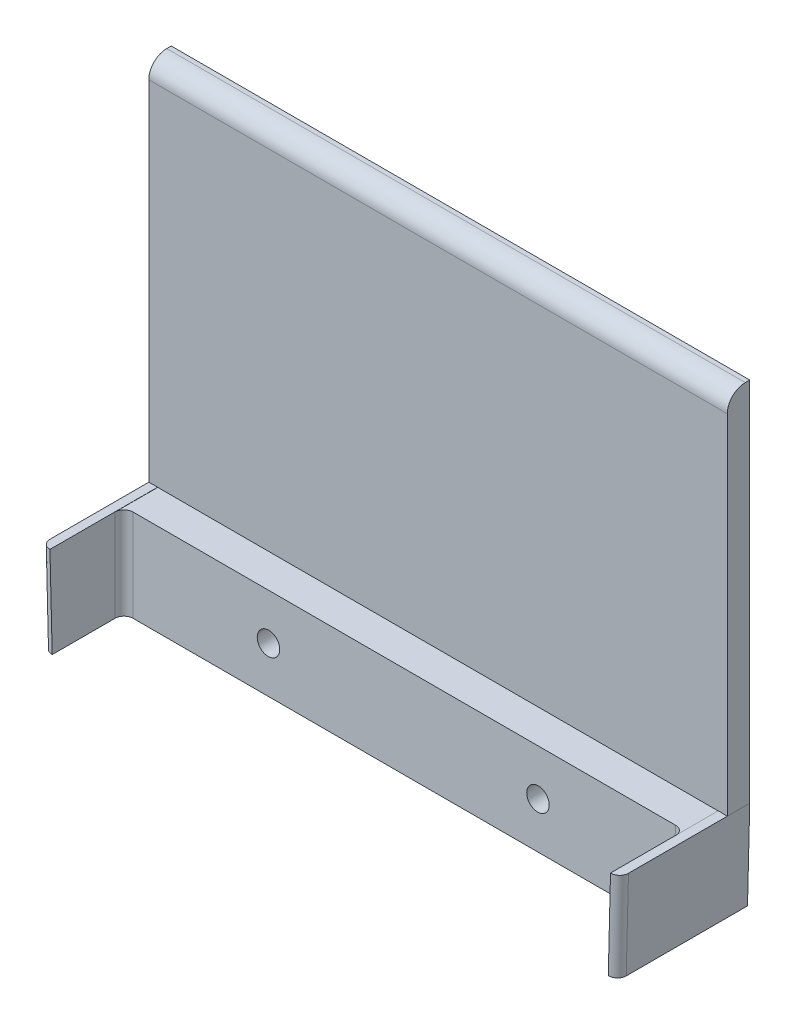
ISO-10303-21;
HEADER;
FILE_DESCRIPTION(('STEP AP214'),'2;1');
FILE_NAME('part.step','',(''),(''),'','','');
FILE_SCHEMA(('AUTOMOTIVE_DESIGN { 1 0 10303 214 1 1 1 1 }'));
ENDSEC;
DATA;
#1=APPLICATION_CONTEXT('core data for automotive mechanical design processes');
#2=APPLICATION_PROTOCOL_DEFINITION('international standard','automotive_design',2000,#1);
#3=PRODUCT_CONTEXT('',#1,'mechanical');
#4=PRODUCT('Part','Part','',(#3));
#5=PRODUCT_RELATED_PRODUCT_CATEGORY('part','',(#4));
#6=PRODUCT_DEFINITION_FORMATION('','',#4);
#7=PRODUCT_DEFINITION_CONTEXT('part definition',#1,'design');
#8=PRODUCT_DEFINITION('design','',#6,#7);
#9=PRODUCT_DEFINITION_SHAPE('','',#8);
#10=(LENGTH_UNIT() NAMED_UNIT(*) SI_UNIT(.MILLI.,.METRE.));
#11=(NAMED_UNIT(*) PLANE_ANGLE_UNIT() SI_UNIT($,.RADIAN.));
#12=(NAMED_UNIT(*) SI_UNIT($,.STERADIAN.) SOLID_ANGLE_UNIT());
#13=UNCERTAINTY_MEASURE_WITH_UNIT(LENGTH_MEASURE(1.E-05),#10,'distance_accuracy_value','');
#14=(GEOMETRIC_REPRESENTATION_CONTEXT(3) GLOBAL_UNCERTAINTY_ASSIGNED_CONTEXT((#13)) GLOBAL_UNIT_ASSIGNED_CONTEXT((#10,
#11,#12)) REPRESENTATION_CONTEXT('',''));
#15=CARTESIAN_POINT('',(0.,0.,0.));
#16=DIRECTION('',(0.,0.,1.));
#17=DIRECTION('',(1.,0.,0.));
#18=AXIS2_PLACEMENT_3D('',#15,#16,#17);
#19=CARTESIAN_POINT('',(-0.144995213723575,5.79980854894297,-2.5));
#20=DIRECTION('',(0.0249921911602031,-0.999687646408123,0.));
#21=DIRECTION('',(0.999687646408123,0.0249921911602031,0.));
#22=AXIS2_PLACEMENT_3D('',#19,#20,#21);
#23=PLANE('',#22);
#24=DIRECTION('',(0.999687646408123,0.0249921911602031,0.));
#25=VECTOR('',#24,1.);
#26=CARTESIAN_POINT('',(-0.144995213723575,5.79980854894297,0.));
#27=LINE('',#26,#25);
#28=CARTESIAN_POINT('',(-32.2002731162217,4.99842660138052,0.));
#29=VERTEX_POINT('',#28);
#30=CARTESIAN_POINT('',(-31.2005854698135,5.02341879254072,0.));
#31=VERTEX_POINT('',#30);
#32=EDGE_CURVE('E121',#29,#31,#27,.T.);
#33=ORIENTED_EDGE('',*,*,#32,.F.);
#34=DIRECTION('',(0.,0.,1.));
#35=VECTOR('',#34,1.);
#36=CARTESIAN_POINT('',(-32.2002731162217,4.99842660138052,-2.5));
#37=LINE('',#36,#35);
#38=CARTESIAN_POINT('',(-32.2002731162217,4.99842660138052,-2.5));
#39=VERTEX_POINT('',#38);
#40=EDGE_CURVE('E115',#39,#29,#37,.T.);
#41=ORIENTED_EDGE('',*,*,#40,.F.);
#42=DIRECTION('',(0.999687646408123,0.0249921911602031,0.));
#43=VECTOR('',#42,1.);
#44=CARTESIAN_POINT('',(-0.144995213723575,5.79980854894297,-2.5));
#45=LINE('',#44,#43);
#46=CARTESIAN_POINT('',(-31.2005854698135,5.02341879254072,-2.5));
#47=VERTEX_POINT('',#46);
#48=EDGE_CURVE('E118',#39,#47,#45,.T.);
#49=ORIENTED_EDGE('',*,*,#48,.T.);
#50=DIRECTION('',(0.,0.,1.));
#51=VECTOR('',#50,1.);
#52=CARTESIAN_POINT('',(-31.2005854698135,5.02341879254072,-2.5));
#53=LINE('',#52,#51);
#54=EDGE_CURVE('E157',#47,#31,#53,.T.);
#55=ORIENTED_EDGE('',*,*,#54,.T.);
#56=EDGE_LOOP('',(#33,#41,#49,#55));
#57=FACE_BOUND('',#56,.T.);
#58=ADVANCED_FACE('F45',(#57),#23,.T.);
#59=CARTESIAN_POINT('',(-32.2002731162217,0.,-2.5));
#60=DIRECTION('',(1.,0.,0.));
#61=DIRECTION('',(0.,0.,-1.));
#62=AXIS2_PLACEMENT_3D('',#59,#60,#61);
#63=PLANE('',#62);
#64=DIRECTION('',(0.,1.,0.));
#65=VECTOR('',#64,1.);
#66=CARTESIAN_POINT('',(-32.2002731162217,0.,0.));
#67=LINE('',#66,#65);
#68=CARTESIAN_POINT('',(-32.2002731162217,43.8,0.));
#69=VERTEX_POINT('',#68);
#70=EDGE_CURVE('E159',#29,#69,#67,.T.);
#71=ORIENTED_EDGE('',*,*,#70,.T.);
#72=CARTESIAN_POINT('',(-32.2002731162217,43.8,-2.));
#73=DIRECTION('',(1.,0.,0.));
#74=DIRECTION('',(0.,0.,-1.));
#75=AXIS2_PLACEMENT_3D('',#72,#73,#74);
#76=CIRCLE('',#75,2.);
#77=CARTESIAN_POINT('',(-32.2002731162217,45.8,-2.));
#78=VERTEX_POINT('',#77);
#79=EDGE_CURVE('E67',#69,#78,#76,.F.);
#80=ORIENTED_EDGE('',*,*,#79,.T.);
#81=DIRECTION('',(0.,0.,1.));
#82=VECTOR('',#81,1.);
#83=CARTESIAN_POINT('',(-32.2002731162217,45.8,-2.5));
#84=LINE('',#83,#82);
#85=CARTESIAN_POINT('',(-32.2002731162217,45.8,-2.5));
#86=VERTEX_POINT('',#85);
#87=EDGE_CURVE('E124',#86,#78,#84,.T.);
#88=ORIENTED_EDGE('',*,*,#87,.F.);
#89=DIRECTION('',(0.,1.,0.));
#90=VECTOR('',#89,1.);
#91=CARTESIAN_POINT('',(-32.2002731162217,0.,-2.5));
#92=LINE('',#91,#90);
#93=EDGE_CURVE('E126',#39,#86,#92,.T.);
#94=ORIENTED_EDGE('',*,*,#93,.F.);
#95=ORIENTED_EDGE('',*,*,#40,.T.);
#96=EDGE_LOOP('',(#71,#80,#88,#94,#95));
#97=FACE_BOUND('',#96,.T.);
#98=ADVANCED_FACE('F127',(#97),#63,.F.);
#99=CARTESIAN_POINT('',(0.,45.8,-2.5));
#100=DIRECTION('',(0.,1.,0.));
#101=DIRECTION('',(0.,0.,1.));
#102=AXIS2_PLACEMENT_3D('',#99,#100,#101);
#103=PLANE('',#102);
#104=ORIENTED_EDGE('',*,*,#87,.T.);
#105=DIRECTION('',(-1.,0.,0.));
#106=VECTOR('',#105,1.);
#107=CARTESIAN_POINT('',(32.2002731162217,45.8,-2.));
#108=LINE('',#107,#106);
#109=CARTESIAN_POINT('',(32.2002731162217,45.8,-2.));
#110=VERTEX_POINT('',#109);
#111=EDGE_CURVE('E53',#78,#110,#108,.F.);
#112=ORIENTED_EDGE('',*,*,#111,.T.);
#113=DIRECTION('',(0.,0.,1.));
#114=VECTOR('',#113,1.);
#115=CARTESIAN_POINT('',(32.2002731162217,45.8,-2.5));
#116=LINE('',#115,#114);
#117=CARTESIAN_POINT('',(32.2002731162217,45.8,-2.5));
#118=VERTEX_POINT('',#117);
#119=EDGE_CURVE('E181',#118,#110,#116,.T.);
#120=ORIENTED_EDGE('',*,*,#119,.F.);
#121=DIRECTION('',(-1.,0.,0.));
#122=VECTOR('',#121,1.);
#123=CARTESIAN_POINT('',(0.,45.8,-2.5));
#124=LINE('',#123,#122);
#125=EDGE_CURVE('E131',#118,#86,#124,.T.);
#126=ORIENTED_EDGE('',*,*,#125,.T.);
#127=EDGE_LOOP('',(#104,#112,#120,#126));
#128=FACE_BOUND('',#127,.T.);
#129=ADVANCED_FACE('F195',(#128),#103,.T.);
#130=CARTESIAN_POINT('',(32.2002731162217,0.,-2.5));
#131=DIRECTION('',(1.,0.,0.));
#132=DIRECTION('',(0.,0.,-1.));
#133=AXIS2_PLACEMENT_3D('',#130,#131,#132);
#134=PLANE('',#133);
#135=ORIENTED_EDGE('',*,*,#119,.T.);
#136=CARTESIAN_POINT('',(32.2002731162217,43.8,-2.));
#137=DIRECTION('',(1.,0.,0.));
#138=DIRECTION('',(0.,0.,-1.));
#139=AXIS2_PLACEMENT_3D('',#136,#137,#138);
#140=CIRCLE('',#139,2.);
#141=CARTESIAN_POINT('',(32.2002731162217,43.8,0.));
#142=VERTEX_POINT('',#141);
#143=EDGE_CURVE('E12',#110,#142,#140,.T.);
#144=ORIENTED_EDGE('',*,*,#143,.T.);
#145=DIRECTION('',(0.,1.,0.));
#146=VECTOR('',#145,1.);
#147=CARTESIAN_POINT('',(32.2002731162217,0.,0.));
#148=LINE('',#147,#146);
#149=CARTESIAN_POINT('',(32.2002731162217,4.99842660138052,0.));
#150=VERTEX_POINT('',#149);
#151=EDGE_CURVE('E161',#150,#142,#148,.T.);
#152=ORIENTED_EDGE('',*,*,#151,.F.);
#153=DIRECTION('',(0.,0.,1.));
#154=VECTOR('',#153,1.);
#155=CARTESIAN_POINT('',(32.2002731162217,4.99842660138052,-2.5));
#156=LINE('',#155,#154);
#157=CARTESIAN_POINT('',(32.2002731162217,4.99842660138052,-2.5));
#158=VERTEX_POINT('',#157);
#159=EDGE_CURVE('E179',#158,#150,#156,.T.);
#160=ORIENTED_EDGE('',*,*,#159,.F.);
#161=DIRECTION('',(0.,1.,0.));
#162=VECTOR('',#161,1.);
#163=CARTESIAN_POINT('',(32.2002731162217,0.,-2.5));
#164=LINE('',#163,#162);
#165=EDGE_CURVE('E144',#158,#118,#164,.T.);
#166=ORIENTED_EDGE('',*,*,#165,.T.);
#167=EDGE_LOOP('',(#135,#144,#152,#160,#166));
#168=FACE_BOUND('',#167,.T.);
#169=ADVANCED_FACE('F193',(#168),#134,.T.);
#170=CARTESIAN_POINT('',(0.144995213723575,5.79980854894297,-2.5));
#171=DIRECTION('',(-0.0249921911602031,-0.999687646408123,0.));
#172=DIRECTION('',(0.999687646408123,-0.0249921911602031,0.));
#173=AXIS2_PLACEMENT_3D('',#170,#171,#172);
#174=PLANE('',#173);
#175=DIRECTION('',(0.999687646408123,-0.0249921911602031,0.));
#176=VECTOR('',#175,1.);
#177=CARTESIAN_POINT('',(0.144995213723575,5.79980854894297,0.));
#178=LINE('',#177,#176);
#179=CARTESIAN_POINT('',(31.2005854698135,5.02341879254072,0.));
#180=VERTEX_POINT('',#179);
#181=EDGE_CURVE('E164',#180,#150,#178,.T.);
#182=ORIENTED_EDGE('',*,*,#181,.F.);
#183=DIRECTION('',(0.,0.,1.));
#184=VECTOR('',#183,1.);
#185=CARTESIAN_POINT('',(31.2005854698135,5.02341879254072,-2.5));
#186=LINE('',#185,#184);
#187=CARTESIAN_POINT('',(31.2005854698135,5.02341879254072,-2.5));
#188=VERTEX_POINT('',#187);
#189=EDGE_CURVE('E177',#188,#180,#186,.T.);
#190=ORIENTED_EDGE('',*,*,#189,.F.);
#191=DIRECTION('',(0.999687646408123,-0.0249921911602031,0.));
#192=VECTOR('',#191,1.);
#193=CARTESIAN_POINT('',(0.144995213723575,5.79980854894297,-2.5));
#194=LINE('',#193,#192);
#195=EDGE_CURVE('E147',#188,#158,#194,.T.);
#196=ORIENTED_EDGE('',*,*,#195,.T.);
#197=ORIENTED_EDGE('',*,*,#159,.T.);
#198=EDGE_LOOP('',(#182,#190,#196,#197));
#199=FACE_BOUND('',#198,.T.);
#200=ADVANCED_FACE('F200',(#199),#174,.T.);
#201=CARTESIAN_POINT('',(31.05559025609,-0.776389756402253,-2.5));
#202=DIRECTION('',(0.999687646408123,-0.0249921911602032,0.));
#203=DIRECTION('',(0.0249921911602032,0.999687646408123,0.));
#204=AXIS2_PLACEMENT_3D('',#201,#202,#203);
#205=PLANE('',#204);
#206=DIRECTION('',(0.0249921911602032,0.999687646408123,0.));
#207=VECTOR('',#206,1.);
#208=CARTESIAN_POINT('',(31.05559025609,-0.776389756402253,0.));
#209=LINE('',#208,#207);
#210=CARTESIAN_POINT('',(31.2,5.00000000000001,0.));
#211=VERTEX_POINT('',#210);
#212=EDGE_CURVE('E167',#211,#180,#209,.T.);
#213=ORIENTED_EDGE('',*,*,#212,.F.);
#214=DIRECTION('',(0.,0.,1.));
#215=VECTOR('',#214,1.);
#216=CARTESIAN_POINT('',(31.2,5.00000000000001,-2.5));
#217=LINE('',#216,#215);
#218=CARTESIAN_POINT('',(31.2,5.00000000000001,-2.5));
#219=VERTEX_POINT('',#218);
#220=EDGE_CURVE('E175',#219,#211,#217,.T.);
#221=ORIENTED_EDGE('',*,*,#220,.F.);
#222=DIRECTION('',(0.0249921911602032,0.999687646408123,0.));
#223=VECTOR('',#222,1.);
#224=CARTESIAN_POINT('',(31.05559025609,-0.776389756402253,-2.5));
#225=LINE('',#224,#223);
#226=EDGE_CURVE('E150',#219,#188,#225,.T.);
#227=ORIENTED_EDGE('',*,*,#226,.T.);
#228=ORIENTED_EDGE('',*,*,#189,.T.);
#229=EDGE_LOOP('',(#213,#221,#227,#228));
#230=FACE_BOUND('',#229,.T.);
#231=ADVANCED_FACE('F203',(#230),#205,.T.);
#232=CARTESIAN_POINT('',(0.,5.00000000000001,-2.5));
#233=DIRECTION('',(0.,-1.,0.));
#234=DIRECTION('',(1.,0.,0.));
#235=AXIS2_PLACEMENT_3D('',#232,#233,#234);
#236=PLANE('',#235);
#237=DIRECTION('',(1.,0.,0.));
#238=VECTOR('',#237,1.);
#239=CARTESIAN_POINT('',(0.,5.00000000000001,0.));
#240=LINE('',#239,#238);
#241=CARTESIAN_POINT('',(-31.2,5.00000000000001,0.));
#242=VERTEX_POINT('',#241);
#243=EDGE_CURVE('E140',#242,#211,#240,.T.);
#244=ORIENTED_EDGE('',*,*,#243,.F.);
#245=DIRECTION('',(0.,0.,1.));
#246=VECTOR('',#245,1.);
#247=CARTESIAN_POINT('',(-31.2,5.00000000000001,-2.5));
#248=LINE('',#247,#246);
#249=CARTESIAN_POINT('',(-31.2,5.00000000000001,-2.5));
#250=VERTEX_POINT('',#249);
#251=EDGE_CURVE('E173',#250,#242,#248,.T.);
#252=ORIENTED_EDGE('',*,*,#251,.F.);
#253=DIRECTION('',(1.,0.,0.));
#254=VECTOR('',#253,1.);
#255=CARTESIAN_POINT('',(0.,5.00000000000001,-2.5));
#256=LINE('',#255,#254);
#257=EDGE_CURVE('E153',#250,#219,#256,.T.);
#258=ORIENTED_EDGE('',*,*,#257,.T.);
#259=ORIENTED_EDGE('',*,*,#220,.T.);
#260=EDGE_LOOP('',(#244,#252,#258,#259));
#261=FACE_BOUND('',#260,.T.);
#262=ADVANCED_FACE('F206',(#261),#236,.T.);
#263=CARTESIAN_POINT('',(-31.05559025609,-0.776389756402253,-2.5));
#264=DIRECTION('',(-0.999687646408123,-0.0249921911602032,0.));
#265=DIRECTION('',(0.0249921911602032,-0.999687646408123,0.));
#266=AXIS2_PLACEMENT_3D('',#263,#264,#265);
#267=PLANE('',#266);
#268=DIRECTION('',(0.0249921911602032,-0.999687646408123,0.));
#269=VECTOR('',#268,1.);
#270=CARTESIAN_POINT('',(-31.05559025609,-0.776389756402253,0.));
#271=LINE('',#270,#269);
#272=EDGE_CURVE('E137',#31,#242,#271,.T.);
#273=ORIENTED_EDGE('',*,*,#272,.F.);
#274=ORIENTED_EDGE('',*,*,#54,.F.);
#275=DIRECTION('',(0.0249921911602032,-0.999687646408123,0.));
#276=VECTOR('',#275,1.);
#277=CARTESIAN_POINT('',(-31.05559025609,-0.776389756402253,-2.5));
#278=LINE('',#277,#276);
#279=EDGE_CURVE('E136',#47,#250,#278,.T.);
#280=ORIENTED_EDGE('',*,*,#279,.T.);
#281=ORIENTED_EDGE('',*,*,#251,.T.);
#282=EDGE_LOOP('',(#273,#274,#280,#281));
#283=FACE_BOUND('',#282,.T.);
#284=ADVANCED_FACE('F209',(#283),#267,.T.);
#285=CARTESIAN_POINT('',(0.,0.,-2.5));
#286=DIRECTION('',(0.,0.,-1.));
#287=DIRECTION('',(-1.,0.,0.));
#288=AXIS2_PLACEMENT_3D('',#285,#286,#287);
#289=PLANE('',#288);
#290=ORIENTED_EDGE('',*,*,#48,.F.);
#291=ORIENTED_EDGE('',*,*,#93,.T.);
#292=ORIENTED_EDGE('',*,*,#125,.F.);
#293=ORIENTED_EDGE('',*,*,#165,.F.);
#294=ORIENTED_EDGE('',*,*,#195,.F.);
#295=ORIENTED_EDGE('',*,*,#226,.F.);
#296=ORIENTED_EDGE('',*,*,#257,.F.);
#297=ORIENTED_EDGE('',*,*,#279,.F.);
#298=EDGE_LOOP('',(#290,#291,#292,#293,#294,#295,#296,#297));
#299=FACE_BOUND('',#298,.T.);
#300=ADVANCED_FACE('F133',(#299),#289,.T.);
#301=CARTESIAN_POINT('',(0.,0.,0.));
#302=DIRECTION('',(0.,0.,-1.));
#303=DIRECTION('',(-1.,0.,0.));
#304=AXIS2_PLACEMENT_3D('',#301,#302,#303);
#305=PLANE('',#304);
#306=ORIENTED_EDGE('',*,*,#151,.T.);
#307=DIRECTION('',(-1.,0.,0.));
#308=VECTOR('',#307,1.);
#309=CARTESIAN_POINT('',(-32.2002731162217,43.8,0.));
#310=LINE('',#309,#308);
#311=EDGE_CURVE('E123',#142,#69,#310,.T.);
#312=ORIENTED_EDGE('',*,*,#311,.T.);
#313=ORIENTED_EDGE('',*,*,#70,.F.);
#314=ORIENTED_EDGE('',*,*,#32,.T.);
#315=ORIENTED_EDGE('',*,*,#272,.T.);
#316=ORIENTED_EDGE('',*,*,#243,.T.);
#317=ORIENTED_EDGE('',*,*,#212,.T.);
#318=ORIENTED_EDGE('',*,*,#181,.T.);
#319=EDGE_LOOP('',(#306,#312,#313,#314,#315,#316,#317,#318));
#320=FACE_BOUND('',#319,.T.);
#321=ADVANCED_FACE('F188',(#320),#305,.F.);
#322=CARTESIAN_POINT('',(0.,43.8,-2.));
#323=DIRECTION('',(1.,0.,0.));
#324=DIRECTION('',(0.,0.,-1.));
#325=AXIS2_PLACEMENT_3D('',#322,#323,#324);
#326=CYLINDRICAL_SURFACE('',#325,2.);
#327=ORIENTED_EDGE('',*,*,#143,.F.);
#328=ORIENTED_EDGE('',*,*,#111,.F.);
#329=ORIENTED_EDGE('',*,*,#79,.F.);
#330=ORIENTED_EDGE('',*,*,#311,.F.);
#331=EDGE_LOOP('',(#327,#328,#329,#330));
#332=FACE_BOUND('',#331,.T.);
#333=ADVANCED_FACE('F47',(#332),#326,.T.);
#334=CLOSED_SHELL('',(#58,#98,#129,#169,#200,#231,#262,#284,#300,#321,#333));
#335=MANIFOLD_SOLID_BREP('B2',#334);
#336=CARTESIAN_POINT('',(0.,5.00000000000001,4.));
#337=DIRECTION('',(0.,-1.,0.));
#338=DIRECTION('',(1.,0.,0.));
#339=AXIS2_PLACEMENT_3D('',#336,#337,#338);
#340=PLANE('',#339);
#341=DIRECTION('',(1.,0.,0.));
#342=VECTOR('',#341,1.);
#343=CARTESIAN_POINT('',(-31.2,5.00000000000002,3.75));
#344=LINE('',#343,#342);
#345=CARTESIAN_POINT('',(-30.2003123535919,5.00000000000002,3.75));
#346=VERTEX_POINT('',#345);
#347=CARTESIAN_POINT('',(30.2003123535919,5.00000000000002,3.75));
#348=VERTEX_POINT('',#347);
#349=EDGE_CURVE('E518',#346,#348,#344,.T.);
#350=ORIENTED_EDGE('',*,*,#349,.T.);
#351=CARTESIAN_POINT('',(30.1996875488129,5.00000000000001,4.75031245118713));
#352=DIRECTION('',(0.,-1.,0.));
#353=DIRECTION('',(-0.707106781186553,0.,0.707106781186542));
#354=AXIS2_PLACEMENT_3D('',#351,#352,#353);
#355=ELLIPSE('',#354,1.00062480480948,1.);
#356=CARTESIAN_POINT('',(31.2,5.00000000000001,4.74968764640812));
#357=VERTEX_POINT('',#356);
#358=EDGE_CURVE('E323',#348,#357,#355,.T.);
#359=ORIENTED_EDGE('',*,*,#358,.T.);
#360=DIRECTION('',(0.,0.,-1.));
#361=VECTOR('',#360,1.);
#362=CARTESIAN_POINT('',(31.2,5.00000000000002,4.));
#363=LINE('',#362,#361);
#364=CARTESIAN_POINT('',(31.2,5.00000000000002,0.));
#365=VERTEX_POINT('',#364);
#366=EDGE_CURVE('E340',#357,#365,#363,.T.);
#367=ORIENTED_EDGE('',*,*,#366,.T.);
#368=DIRECTION('',(-1.,0.,0.));
#369=VECTOR('',#368,1.);
#370=CARTESIAN_POINT('',(0.,5.00000000000001,0.));
#371=LINE('',#370,#369);
#372=CARTESIAN_POINT('',(-31.2,5.00000000000002,0.));
#373=VERTEX_POINT('',#372);
#374=EDGE_CURVE('E520',#365,#373,#371,.T.);
#375=ORIENTED_EDGE('',*,*,#374,.T.);
#376=DIRECTION('',(0.,0.,-1.));
#377=VECTOR('',#376,1.);
#378=CARTESIAN_POINT('',(-31.2,5.,4.));
#379=LINE('',#378,#377);
#380=CARTESIAN_POINT('',(-31.2,5.00000000000001,4.74968764640812));
#381=VERTEX_POINT('',#380);
#382=EDGE_CURVE('E530',#381,#373,#379,.T.);
#383=ORIENTED_EDGE('',*,*,#382,.F.);
#384=CARTESIAN_POINT('',(-30.1996875488129,5.00000000000001,4.75031245118713));
#385=DIRECTION('',(0.,1.,0.));
#386=DIRECTION('',(0.707106781186553,0.,0.707106781186542));
#387=AXIS2_PLACEMENT_3D('',#384,#385,#386);
#388=ELLIPSE('',#387,1.00062480480948,1.);
#389=EDGE_CURVE('E499',#346,#381,#388,.T.);
#390=ORIENTED_EDGE('',*,*,#389,.F.);
#391=EDGE_LOOP('',(#350,#359,#367,#375,#383,#390));
#392=FACE_BOUND('',#391,.T.);
#393=ADVANCED_FACE('F314',(#392),#340,.F.);
#394=CARTESIAN_POINT('',(0.,-4.99999999999999,4.));
#395=DIRECTION('',(0.,-1.,0.));
#396=DIRECTION('',(1.,0.,0.));
#397=AXIS2_PLACEMENT_3D('',#394,#395,#396);
#398=PLANE('',#397);
#399=DIRECTION('',(0.,0.,-1.));
#400=VECTOR('',#399,1.);
#401=CARTESIAN_POINT('',(-30.95,-5.,4.));
#402=LINE('',#401,#400);
#403=CARTESIAN_POINT('',(-30.95,-4.99999999999998,4.99968764640812));
#404=VERTEX_POINT('',#403);
#405=CARTESIAN_POINT('',(-30.95,-4.99999999999999,-2.5));
#406=VERTEX_POINT('',#405);
#407=EDGE_CURVE('E528',#404,#406,#402,.T.);
#408=ORIENTED_EDGE('',*,*,#407,.T.);
#409=DIRECTION('',(-1.,0.,0.));
#410=VECTOR('',#409,1.);
#411=CARTESIAN_POINT('',(0.,-4.99999999999999,-2.5));
#412=LINE('',#411,#410);
#413=CARTESIAN_POINT('',(30.95,-4.99999999999998,-2.5));
#414=VERTEX_POINT('',#413);
#415=EDGE_CURVE('E462',#414,#406,#412,.T.);
#416=ORIENTED_EDGE('',*,*,#415,.F.);
#417=DIRECTION('',(0.,0.,-1.));
#418=VECTOR('',#417,1.);
#419=CARTESIAN_POINT('',(30.95,-4.99999999999998,4.));
#420=LINE('',#419,#418);
#421=CARTESIAN_POINT('',(30.95,-4.99999999999998,4.99968764640812));
#422=VERTEX_POINT('',#421);
#423=EDGE_CURVE('E352',#422,#414,#420,.T.);
#424=ORIENTED_EDGE('',*,*,#423,.F.);
#425=CARTESIAN_POINT('',(29.9496875488129,-4.99999999999998,5.00031245118713));
#426=DIRECTION('',(0.,-1.,0.));
#427=DIRECTION('',(-0.707106781186553,0.,0.707106781186542));
#428=AXIS2_PLACEMENT_3D('',#425,#426,#427);
#429=ELLIPSE('',#428,1.00062480480948,1.);
#430=CARTESIAN_POINT('',(29.9503123535919,-4.99999999999998,4.));
#431=VERTEX_POINT('',#430);
#432=EDGE_CURVE('E43',#422,#431,#429,.F.);
#433=ORIENTED_EDGE('',*,*,#432,.T.);
#434=DIRECTION('',(-1.,0.,0.));
#435=VECTOR('',#434,1.);
#436=CARTESIAN_POINT('',(0.,-4.99999999999999,4.));
#437=LINE('',#436,#435);
#438=CARTESIAN_POINT('',(-29.9503123535919,-5.,4.));
#439=VERTEX_POINT('',#438);
#440=EDGE_CURVE('E521',#431,#439,#437,.T.);
#441=ORIENTED_EDGE('',*,*,#440,.T.);
#442=CARTESIAN_POINT('',(-29.9496875488129,-4.99999999999998,5.00031245118713));
#443=DIRECTION('',(0.,1.,0.));
#444=DIRECTION('',(0.707106781186553,0.,0.707106781186542));
#445=AXIS2_PLACEMENT_3D('',#442,#443,#444);
#446=ELLIPSE('',#445,1.00062480480948,1.);
#447=EDGE_CURVE('E331',#404,#439,#446,.F.);
#448=ORIENTED_EDGE('',*,*,#447,.F.);
#449=EDGE_LOOP('',(#408,#416,#424,#433,#441,#448));
#450=FACE_BOUND('',#449,.T.);
#451=ADVANCED_FACE('F570',(#450),#398,.T.);
#452=CARTESIAN_POINT('',(0.,0.,0.));
#453=DIRECTION('',(0.,0.,1.));
#454=DIRECTION('',(1.,0.,0.));
#455=AXIS2_PLACEMENT_3D('',#452,#453,#454);
#456=PLANE('',#455);
#457=DIRECTION('',(-0.999687646408123,0.0249921911602031,0.));
#458=VECTOR('',#457,1.);
#459=CARTESIAN_POINT('',(32.2002731162217,4.99842660138052,0.));
#460=LINE('',#459,#458);
#461=CARTESIAN_POINT('',(32.2002731162217,4.99842660138052,0.));
#462=VERTEX_POINT('',#461);
#463=CARTESIAN_POINT('',(31.2005854698135,5.02341879254072,0.));
#464=VERTEX_POINT('',#463);
#465=EDGE_CURVE('E508',#462,#464,#460,.T.);
#466=ORIENTED_EDGE('',*,*,#465,.F.);
#467=DIRECTION('',(-1.,0.,0.));
#468=VECTOR('',#467,1.);
#469=CARTESIAN_POINT('',(0.,4.99842660138052,0.));
#470=LINE('',#469,#468);
#471=CARTESIAN_POINT('',(-32.2002731162217,4.99842660138052,0.));
#472=VERTEX_POINT('',#471);
#473=EDGE_CURVE('E432',#462,#472,#470,.T.);
#474=ORIENTED_EDGE('',*,*,#473,.T.);
#475=DIRECTION('',(0.999687646408123,0.0249921911602031,0.));
#476=VECTOR('',#475,1.);
#477=CARTESIAN_POINT('',(-32.2002731162217,4.99842660138052,0.));
#478=LINE('',#477,#476);
#479=CARTESIAN_POINT('',(-31.2005854698135,5.02341879254072,0.));
#480=VERTEX_POINT('',#479);
#481=EDGE_CURVE('E475',#472,#480,#478,.T.);
#482=ORIENTED_EDGE('',*,*,#481,.T.);
#483=DIRECTION('',(-0.0249921911602032,0.999687646408123,0.));
#484=VECTOR('',#483,1.);
#485=CARTESIAN_POINT('',(-30.95,-4.99999999999999,0.));
#486=LINE('',#485,#484);
#487=EDGE_CURVE('E436',#373,#480,#486,.T.);
#488=ORIENTED_EDGE('',*,*,#487,.F.);
#489=ORIENTED_EDGE('',*,*,#374,.F.);
#490=DIRECTION('',(0.0249921911602032,0.999687646408123,0.));
#491=VECTOR('',#490,1.);
#492=CARTESIAN_POINT('',(30.95,-4.99999999999999,0.));
#493=LINE('',#492,#491);
#494=EDGE_CURVE('E503',#365,#464,#493,.T.);
#495=ORIENTED_EDGE('',*,*,#494,.T.);
#496=EDGE_LOOP('',(#466,#474,#482,#488,#489,#495));
#497=FACE_BOUND('',#496,.T.);
#498=ADVANCED_FACE('F576',(#497),#456,.F.);
#499=CARTESIAN_POINT('',(-31.2,-4.99999999999998,4.));
#500=DIRECTION('',(0.,-0.0249921911602031,-0.999687646408123));
#501=DIRECTION('',(0.,0.999687646408123,-0.0249921911602031));
#502=AXIS2_PLACEMENT_3D('',#499,#500,#501);
#503=PLANE('',#502);
#504=CARTESIAN_POINT('',(15.,0.,3.875));
#505=DIRECTION('',(0.,-0.0249921911602031,-0.999687646408123));
#506=DIRECTION('',(0.,0.999687646408123,-0.0249921911602031));
#507=AXIS2_PLACEMENT_3D('',#504,#505,#506);
#508=ELLIPSE('',#507,1.2503905639839,1.24999999999999);
#509=CARTESIAN_POINT('',(15.,1.24999999999999,3.84375));
#510=VERTEX_POINT('',#509);
#511=EDGE_CURVE('E318',#510,#510,#508,.T.);
#512=ORIENTED_EDGE('',*,*,#511,.T.);
#513=EDGE_LOOP('',(#512));
#514=FACE_BOUND('',#513,.T.);
#515=CARTESIAN_POINT('',(-15.,0.,3.875));
#516=DIRECTION('',(0.,-0.0249921911602031,-0.999687646408123));
#517=DIRECTION('',(0.,0.999687646408123,-0.0249921911602031));
#518=AXIS2_PLACEMENT_3D('',#515,#516,#517);
#519=ELLIPSE('',#518,1.2503905639839,1.24999999999999);
#520=CARTESIAN_POINT('',(-15.,1.24999999999999,3.84375));
#521=VERTEX_POINT('',#520);
#522=EDGE_CURVE('E455',#521,#521,#519,.T.);
#523=ORIENTED_EDGE('',*,*,#522,.T.);
#524=EDGE_LOOP('',(#523));
#525=FACE_BOUND('',#524,.T.);
#526=ORIENTED_EDGE('',*,*,#349,.F.);
#527=DIRECTION('',(-0.0249843896331955,0.999375585327815,-0.0249843896331954));
#528=VECTOR('',#527,1.);
#529=CARTESIAN_POINT('',(-30.20093637834,5.02496098992281,3.74937597525193));
#530=LINE('',#529,#528);
#531=EDGE_CURVE('E495',#439,#346,#530,.T.);
#532=ORIENTED_EDGE('',*,*,#531,.F.);
#533=ORIENTED_EDGE('',*,*,#440,.F.);
#534=DIRECTION('',(0.0249843896331955,0.999375585327815,-0.0249843896331954));
#535=VECTOR('',#534,1.);
#536=CARTESIAN_POINT('',(30.20093637834,5.02496098992281,3.74937597525193));
#537=LINE('',#536,#535);
#538=EDGE_CURVE('E537',#431,#348,#537,.T.);
#539=ORIENTED_EDGE('',*,*,#538,.T.);
#540=EDGE_LOOP('',(#526,#532,#533,#539));
#541=FACE_BOUND('',#540,.T.);
#542=ADVANCED_FACE('F625',(#514,#525,#541),#503,.F.);
#543=CARTESIAN_POINT('',(32.2002731162217,4.99842660138052,0.));
#544=DIRECTION('',(-0.0249921911602031,-0.999687646408123,0.));
#545=DIRECTION('',(0.999687646408123,-0.0249921911602031,0.));
#546=AXIS2_PLACEMENT_3D('',#543,#544,#545);
#547=PLANE('',#546);
#548=DIRECTION('',(0.,0.,1.));
#549=VECTOR('',#548,1.);
#550=CARTESIAN_POINT('',(31.2005854698135,5.02341879254072,0.));
#551=LINE('',#550,#549);
#552=CARTESIAN_POINT('',(31.2005854698135,5.02341879254072,12.));
#553=VERTEX_POINT('',#552);
#554=EDGE_CURVE('E510',#464,#553,#551,.T.);
#555=ORIENTED_EDGE('',*,*,#554,.T.);
#556=CARTESIAN_POINT('',(31.2005854698136,5.02341879254072,11.));
#557=DIRECTION('',(-0.0249921911602031,-0.999687646408123,0.));
#558=DIRECTION('',(0.999687646408123,-0.0249921911602031,0.));
#559=AXIS2_PLACEMENT_3D('',#556,#557,#558);
#560=CIRCLE('',#559,1.);
#561=CARTESIAN_POINT('',(32.2002731162217,4.99842660138052,11.));
#562=VERTEX_POINT('',#561);
#563=EDGE_CURVE('E535',#553,#562,#560,.F.);
#564=ORIENTED_EDGE('',*,*,#563,.T.);
#565=DIRECTION('',(0.,0.,1.));
#566=VECTOR('',#565,1.);
#567=CARTESIAN_POINT('',(32.2002731162217,4.99842660138052,0.));
#568=LINE('',#567,#566);
#569=EDGE_CURVE('E504',#462,#562,#568,.T.);
#570=ORIENTED_EDGE('',*,*,#569,.F.);
#571=ORIENTED_EDGE('',*,*,#465,.T.);
#572=EDGE_LOOP('',(#555,#564,#570,#571));
#573=FACE_BOUND('',#572,.T.);
#574=ADVANCED_FACE('F592',(#573),#547,.F.);
#575=CARTESIAN_POINT('',(31.9496876464081,-5.02499219116019,0.));
#576=DIRECTION('',(0.0249921911602031,0.999687646408123,0.));
#577=DIRECTION('',(-0.999687646408123,0.0249921911602031,0.));
#578=AXIS2_PLACEMENT_3D('',#575,#576,#577);
#579=PLANE('',#578);
#580=DIRECTION('',(0.,0.,-1.));
#581=VECTOR('',#580,1.);
#582=CARTESIAN_POINT('',(31.9496876464081,-5.02499219116019,0.));
#583=LINE('',#582,#581);
#584=CARTESIAN_POINT('',(31.9496876464081,-5.02499219116019,11.));
#585=VERTEX_POINT('',#584);
#586=CARTESIAN_POINT('',(31.9496876464081,-5.02499219116019,-2.5));
#587=VERTEX_POINT('',#586);
#588=EDGE_CURVE('E443',#585,#587,#583,.T.);
#589=ORIENTED_EDGE('',*,*,#588,.F.);
#590=CARTESIAN_POINT('',(30.95,-4.99999999999999,11.));
#591=DIRECTION('',(0.0249921911602031,0.999687646408123,0.));
#592=DIRECTION('',(-0.999687646408123,0.0249921911602031,0.));
#593=AXIS2_PLACEMENT_3D('',#590,#591,#592);
#594=CIRCLE('',#593,1.);
#595=CARTESIAN_POINT('',(30.95,-4.99999999999999,12.));
#596=VERTEX_POINT('',#595);
#597=EDGE_CURVE('E360',#585,#596,#594,.F.);
#598=ORIENTED_EDGE('',*,*,#597,.T.);
#599=DIRECTION('',(0.,0.,-1.));
#600=VECTOR('',#599,1.);
#601=CARTESIAN_POINT('',(30.95,-4.99999999999999,0.));
#602=LINE('',#601,#600);
#603=EDGE_CURVE('E506',#596,#422,#602,.T.);
#604=ORIENTED_EDGE('',*,*,#603,.T.);
#605=ORIENTED_EDGE('',*,*,#423,.T.);
#606=DIRECTION('',(-0.999687646408123,0.0249921911602031,0.));
#607=VECTOR('',#606,1.);
#608=CARTESIAN_POINT('',(-0.105590256089944,-4.22361024359773,-2.5));
#609=LINE('',#608,#607);
#610=EDGE_CURVE('E447',#587,#414,#609,.T.);
#611=ORIENTED_EDGE('',*,*,#610,.F.);
#612=EDGE_LOOP('',(#589,#598,#604,#605,#611));
#613=FACE_BOUND('',#612,.T.);
#614=ADVANCED_FACE('F596',(#613),#579,.F.);
#615=CARTESIAN_POINT('',(32.0552779024981,-0.801381947562457,0.));
#616=DIRECTION('',(0.999687646408123,-0.0249921911602032,0.));
#617=DIRECTION('',(0.0249921911602032,0.999687646408123,0.));
#618=AXIS2_PLACEMENT_3D('',#615,#616,#617);
#619=PLANE('',#618);
#620=ORIENTED_EDGE('',*,*,#569,.T.);
#621=DIRECTION('',(-0.0249921911602032,-0.999687646408123,0.));
#622=VECTOR('',#621,1.);
#623=CARTESIAN_POINT('',(31.9496876464082,-5.02499219116019,11.));
#624=LINE('',#623,#622);
#625=EDGE_CURVE('E532',#562,#585,#624,.T.);
#626=ORIENTED_EDGE('',*,*,#625,.T.);
#627=ORIENTED_EDGE('',*,*,#588,.T.);
#628=DIRECTION('',(-0.0249921911602032,-0.999687646408123,0.));
#629=VECTOR('',#628,1.);
#630=CARTESIAN_POINT('',(32.0552779024981,-0.801381947562456,-2.5));
#631=LINE('',#630,#629);
#632=CARTESIAN_POINT('',(32.2002731162217,4.99842660138052,-2.5));
#633=VERTEX_POINT('',#632);
#634=EDGE_CURVE('E440',#633,#587,#631,.T.);
#635=ORIENTED_EDGE('',*,*,#634,.F.);
#636=DIRECTION('',(0.,0.,1.));
#637=VECTOR('',#636,1.);
#638=CARTESIAN_POINT('',(32.2002731162217,4.99842660138052,-2.5));
#639=LINE('',#638,#637);
#640=EDGE_CURVE('E426',#633,#462,#639,.T.);
#641=ORIENTED_EDGE('',*,*,#640,.T.);
#642=EDGE_LOOP('',(#620,#626,#627,#635,#641));
#643=FACE_BOUND('',#642,.T.);
#644=ADVANCED_FACE('F441',(#643),#619,.T.);
#645=CARTESIAN_POINT('',(31.05559025609,-0.776389756402253,0.));
#646=DIRECTION('',(0.999687646408123,-0.0249921911602032,0.));
#647=DIRECTION('',(0.0249921911602032,0.999687646408123,0.));
#648=AXIS2_PLACEMENT_3D('',#645,#646,#647);
#649=PLANE('',#648);
#650=ORIENTED_EDGE('',*,*,#366,.F.);
#651=DIRECTION('',(0.0249843896331955,0.999375585327815,-0.0249843896331954));
#652=VECTOR('',#651,1.);
#653=CARTESIAN_POINT('',(30.9506240247481,-4.97503901007719,4.99906362166005));
#654=LINE('',#653,#652);
#655=EDGE_CURVE('E540',#357,#422,#654,.F.);
#656=ORIENTED_EDGE('',*,*,#655,.T.);
#657=ORIENTED_EDGE('',*,*,#603,.F.);
#658=DIRECTION('',(-0.0249921911602032,-0.999687646408123,0.));
#659=VECTOR('',#658,1.);
#660=CARTESIAN_POINT('',(30.95,-4.99999999999999,12.));
#661=LINE('',#660,#659);
#662=EDGE_CURVE('E512',#553,#596,#661,.T.);
#663=ORIENTED_EDGE('',*,*,#662,.F.);
#664=ORIENTED_EDGE('',*,*,#554,.F.);
#665=ORIENTED_EDGE('',*,*,#494,.F.);
#666=EDGE_LOOP('',(#650,#656,#657,#663,#664,#665));
#667=FACE_BOUND('',#666,.T.);
#668=ADVANCED_FACE('F581',(#667),#649,.F.);
#669=CARTESIAN_POINT('',(31.05559025609,-0.776389756402253,11.));
#670=DIRECTION('',(0.0249921911602032,0.999687646408123,0.));
#671=DIRECTION('',(-0.999687646408123,0.0249921911602032,0.));
#672=AXIS2_PLACEMENT_3D('',#669,#670,#671);
#673=CYLINDRICAL_SURFACE('',#672,1.);
#674=ORIENTED_EDGE('',*,*,#563,.F.);
#675=ORIENTED_EDGE('',*,*,#662,.T.);
#676=ORIENTED_EDGE('',*,*,#597,.F.);
#677=ORIENTED_EDGE('',*,*,#625,.F.);
#678=EDGE_LOOP('',(#674,#675,#676,#677));
#679=FACE_BOUND('',#678,.T.);
#680=ADVANCED_FACE('F579',(#679),#673,.T.);
#681=CARTESIAN_POINT('',(29.9121411224099,-6.50185705612049,5.03785887759014));
#682=DIRECTION('',(-0.0249843896331955,-0.999375585327815,0.0249843896331954));
#683=DIRECTION('',(0.999687646408123,-0.0249921911602032,0.));
#684=AXIS2_PLACEMENT_3D('',#681,#682,#683);
#685=CYLINDRICAL_SURFACE('',#684,1.);
#686=ORIENTED_EDGE('',*,*,#432,.F.);
#687=ORIENTED_EDGE('',*,*,#655,.F.);
#688=ORIENTED_EDGE('',*,*,#358,.F.);
#689=ORIENTED_EDGE('',*,*,#538,.F.);
#690=EDGE_LOOP('',(#686,#687,#688,#689));
#691=FACE_BOUND('',#690,.T.);
#692=ADVANCED_FACE('F316',(#691),#685,.F.);
#693=CARTESIAN_POINT('',(-32.2002731162217,4.99842660138052,0.));
#694=DIRECTION('',(0.0249921911602031,-0.999687646408123,0.));
#695=DIRECTION('',(-0.999687646408123,-0.0249921911602031,0.));
#696=AXIS2_PLACEMENT_3D('',#693,#694,#695);
#697=PLANE('',#696);
#698=DIRECTION('',(0.,0.,1.));
#699=VECTOR('',#698,1.);
#700=CARTESIAN_POINT('',(-31.2005854698135,5.02341879254072,0.));
#701=LINE('',#700,#699);
#702=CARTESIAN_POINT('',(-31.2005854698135,5.02341879254072,12.));
#703=VERTEX_POINT('',#702);
#704=EDGE_CURVE('E478',#480,#703,#701,.T.);
#705=ORIENTED_EDGE('',*,*,#704,.F.);
#706=ORIENTED_EDGE('',*,*,#481,.F.);
#707=DIRECTION('',(0.,0.,1.));
#708=VECTOR('',#707,1.);
#709=CARTESIAN_POINT('',(-32.2002731162217,4.99842660138052,0.));
#710=LINE('',#709,#708);
#711=CARTESIAN_POINT('',(-32.2002731162217,4.99842660138052,11.));
#712=VERTEX_POINT('',#711);
#713=EDGE_CURVE('E469',#472,#712,#710,.T.);
#714=ORIENTED_EDGE('',*,*,#713,.T.);
#715=CARTESIAN_POINT('',(-31.2005854698136,5.02341879254072,11.));
#716=DIRECTION('',(-0.0249921911602031,0.999687646408123,0.));
#717=DIRECTION('',(-0.999687646408123,-0.0249921911602031,0.));
#718=AXIS2_PLACEMENT_3D('',#715,#716,#717);
#719=CIRCLE('',#718,1.);
#720=EDGE_CURVE('E492',#703,#712,#719,.F.);
#721=ORIENTED_EDGE('',*,*,#720,.F.);
#722=EDGE_LOOP('',(#705,#706,#714,#721));
#723=FACE_BOUND('',#722,.T.);
#724=ADVANCED_FACE('F586',(#723),#697,.F.);
#725=CARTESIAN_POINT('',(-31.9496876464081,-5.02499219116019,0.));
#726=DIRECTION('',(-0.0249921911602031,0.999687646408123,0.));
#727=DIRECTION('',(0.999687646408123,0.0249921911602031,0.));
#728=AXIS2_PLACEMENT_3D('',#725,#726,#727);
#729=PLANE('',#728);
#730=DIRECTION('',(0.,0.,-1.));
#731=VECTOR('',#730,1.);
#732=CARTESIAN_POINT('',(-31.9496876464081,-5.02499219116019,0.));
#733=LINE('',#732,#731);
#734=CARTESIAN_POINT('',(-31.9496876464081,-5.02499219116019,11.));
#735=VERTEX_POINT('',#734);
#736=CARTESIAN_POINT('',(-31.9496876464081,-5.02499219116019,-2.5));
#737=VERTEX_POINT('',#736);
#738=EDGE_CURVE('E472',#735,#737,#733,.T.);
#739=ORIENTED_EDGE('',*,*,#738,.T.);
#740=DIRECTION('',(-0.999687646408123,-0.0249921911602031,0.));
#741=VECTOR('',#740,1.);
#742=CARTESIAN_POINT('',(0.105590256089944,-4.22361024359773,-2.5));
#743=LINE('',#742,#741);
#744=EDGE_CURVE('E465',#406,#737,#743,.T.);
#745=ORIENTED_EDGE('',*,*,#744,.F.);
#746=ORIENTED_EDGE('',*,*,#407,.F.);
#747=DIRECTION('',(0.,0.,-1.));
#748=VECTOR('',#747,1.);
#749=CARTESIAN_POINT('',(-30.95,-4.99999999999999,0.));
#750=LINE('',#749,#748);
#751=CARTESIAN_POINT('',(-30.95,-4.99999999999999,12.));
#752=VERTEX_POINT('',#751);
#753=EDGE_CURVE('E473',#752,#404,#750,.T.);
#754=ORIENTED_EDGE('',*,*,#753,.F.);
#755=CARTESIAN_POINT('',(-30.95,-4.99999999999999,11.));
#756=DIRECTION('',(0.0249921911602031,-0.999687646408123,0.));
#757=DIRECTION('',(0.999687646408123,0.0249921911602031,0.));
#758=AXIS2_PLACEMENT_3D('',#755,#756,#757);
#759=CIRCLE('',#758,1.);
#760=EDGE_CURVE('E489',#735,#752,#759,.F.);
#761=ORIENTED_EDGE('',*,*,#760,.F.);
#762=EDGE_LOOP('',(#739,#745,#746,#754,#761));
#763=FACE_BOUND('',#762,.T.);
#764=ADVANCED_FACE('F601',(#763),#729,.F.);
#765=CARTESIAN_POINT('',(-32.0552779024981,-0.801381947562457,0.));
#766=DIRECTION('',(-0.999687646408123,-0.0249921911602032,0.));
#767=DIRECTION('',(-0.0249921911602032,0.999687646408123,0.));
#768=AXIS2_PLACEMENT_3D('',#765,#766,#767);
#769=PLANE('',#768);
#770=ORIENTED_EDGE('',*,*,#713,.F.);
#771=DIRECTION('',(0.,0.,1.));
#772=VECTOR('',#771,1.);
#773=CARTESIAN_POINT('',(-32.2002731162217,4.99842660138052,-2.5));
#774=LINE('',#773,#772);
#775=CARTESIAN_POINT('',(-32.2002731162217,4.99842660138052,-2.5));
#776=VERTEX_POINT('',#775);
#777=EDGE_CURVE('E437',#776,#472,#774,.T.);
#778=ORIENTED_EDGE('',*,*,#777,.F.);
#779=DIRECTION('',(-0.0249921911602032,0.999687646408123,0.));
#780=VECTOR('',#779,1.);
#781=CARTESIAN_POINT('',(-32.0552779024981,-0.801381947562456,-2.5));
#782=LINE('',#781,#780);
#783=EDGE_CURVE('E452',#737,#776,#782,.T.);
#784=ORIENTED_EDGE('',*,*,#783,.F.);
#785=ORIENTED_EDGE('',*,*,#738,.F.);
#786=DIRECTION('',(0.0249921911602032,-0.999687646408123,0.));
#787=VECTOR('',#786,1.);
#788=CARTESIAN_POINT('',(-31.9496876464082,-5.02499219116019,11.));
#789=LINE('',#788,#787);
#790=EDGE_CURVE('E487',#712,#735,#789,.T.);
#791=ORIENTED_EDGE('',*,*,#790,.F.);
#792=EDGE_LOOP('',(#770,#778,#784,#785,#791));
#793=FACE_BOUND('',#792,.T.);
#794=ADVANCED_FACE('F613',(#793),#769,.T.);
#795=CARTESIAN_POINT('',(-31.05559025609,-0.776389756402253,0.));
#796=DIRECTION('',(-0.999687646408123,-0.0249921911602032,0.));
#797=DIRECTION('',(-0.0249921911602032,0.999687646408123,0.));
#798=AXIS2_PLACEMENT_3D('',#795,#796,#797);
#799=PLANE('',#798);
#800=DIRECTION('',(-0.0249843896331955,0.999375585327815,-0.0249843896331954));
#801=VECTOR('',#800,1.);
#802=CARTESIAN_POINT('',(-30.9506240247481,-4.97503901007719,4.99906362166005));
#803=LINE('',#802,#801);
#804=EDGE_CURVE('E497',#381,#404,#803,.F.);
#805=ORIENTED_EDGE('',*,*,#804,.F.);
#806=ORIENTED_EDGE('',*,*,#382,.T.);
#807=ORIENTED_EDGE('',*,*,#487,.T.);
#808=ORIENTED_EDGE('',*,*,#704,.T.);
#809=DIRECTION('',(0.0249921911602032,-0.999687646408123,0.));
#810=VECTOR('',#809,1.);
#811=CARTESIAN_POINT('',(-30.95,-4.99999999999999,12.));
#812=LINE('',#811,#810);
#813=EDGE_CURVE('E481',#703,#752,#812,.T.);
#814=ORIENTED_EDGE('',*,*,#813,.T.);
#815=ORIENTED_EDGE('',*,*,#753,.T.);
#816=EDGE_LOOP('',(#805,#806,#807,#808,#814,#815));
#817=FACE_BOUND('',#816,.T.);
#818=ADVANCED_FACE('F606',(#817),#799,.F.);
#819=CARTESIAN_POINT('',(-31.05559025609,-0.776389756402253,11.));
#820=DIRECTION('',(-0.0249921911602032,0.999687646408123,0.));
#821=DIRECTION('',(0.999687646408123,0.0249921911602032,0.));
#822=AXIS2_PLACEMENT_3D('',#819,#820,#821);
#823=CYLINDRICAL_SURFACE('',#822,1.);
#824=ORIENTED_EDGE('',*,*,#720,.T.);
#825=ORIENTED_EDGE('',*,*,#790,.T.);
#826=ORIENTED_EDGE('',*,*,#760,.T.);
#827=ORIENTED_EDGE('',*,*,#813,.F.);
#828=EDGE_LOOP('',(#824,#825,#826,#827));
#829=FACE_BOUND('',#828,.T.);
#830=ADVANCED_FACE('F609',(#829),#823,.T.);
#831=CARTESIAN_POINT('',(-29.9121411224099,-6.50185705612049,5.03785887759014));
#832=DIRECTION('',(0.0249843896331955,-0.999375585327815,0.0249843896331954));
#833=DIRECTION('',(-0.999687646408123,-0.0249921911602032,0.));
#834=AXIS2_PLACEMENT_3D('',#831,#832,#833);
#835=CYLINDRICAL_SURFACE('',#834,1.);
#836=ORIENTED_EDGE('',*,*,#447,.T.);
#837=ORIENTED_EDGE('',*,*,#531,.T.);
#838=ORIENTED_EDGE('',*,*,#389,.T.);
#839=ORIENTED_EDGE('',*,*,#804,.T.);
#840=EDGE_LOOP('',(#836,#837,#838,#839));
#841=FACE_BOUND('',#840,.T.);
#842=ADVANCED_FACE('F567',(#841),#835,.F.);
#843=CARTESIAN_POINT('',(0.,4.99842660138052,-2.5));
#844=DIRECTION('',(0.,1.,0.));
#845=DIRECTION('',(0.,0.,1.));
#846=AXIS2_PLACEMENT_3D('',#843,#844,#845);
#847=PLANE('',#846);
#848=ORIENTED_EDGE('',*,*,#473,.F.);
#849=ORIENTED_EDGE('',*,*,#640,.F.);
#850=DIRECTION('',(-1.,0.,0.));
#851=VECTOR('',#850,1.);
#852=CARTESIAN_POINT('',(0.,4.99842660138052,-2.5));
#853=LINE('',#852,#851);
#854=EDGE_CURVE('E430',#633,#776,#853,.T.);
#855=ORIENTED_EDGE('',*,*,#854,.T.);
#856=ORIENTED_EDGE('',*,*,#777,.T.);
#857=EDGE_LOOP('',(#848,#849,#855,#856));
#858=FACE_BOUND('',#857,.T.);
#859=ADVANCED_FACE('F428',(#858),#847,.T.);
#860=CARTESIAN_POINT('',(0.,0.,-2.5));
#861=DIRECTION('',(0.,0.,-1.));
#862=DIRECTION('',(-1.,0.,0.));
#863=AXIS2_PLACEMENT_3D('',#860,#861,#862);
#864=PLANE('',#863);
#865=CARTESIAN_POINT('',(15.,0.,-2.5));
#866=DIRECTION('',(0.,0.,-1.));
#867=DIRECTION('',(-1.,0.,0.));
#868=AXIS2_PLACEMENT_3D('',#865,#866,#867);
#869=CIRCLE('',#868,1.24999999999999);
#870=CARTESIAN_POINT('',(13.75,0.,-2.5));
#871=VERTEX_POINT('',#870);
#872=EDGE_CURVE('E549',#871,#871,#869,.T.);
#873=ORIENTED_EDGE('',*,*,#872,.F.);
#874=EDGE_LOOP('',(#873));
#875=FACE_BOUND('',#874,.T.);
#876=CARTESIAN_POINT('',(-15.,0.,-2.5));
#877=DIRECTION('',(0.,0.,-1.));
#878=DIRECTION('',(-1.,0.,0.));
#879=AXIS2_PLACEMENT_3D('',#876,#877,#878);
#880=CIRCLE('',#879,1.24999999999999);
#881=CARTESIAN_POINT('',(-16.25,0.,-2.5));
#882=VERTEX_POINT('',#881);
#883=EDGE_CURVE('E458',#882,#882,#880,.T.);
#884=ORIENTED_EDGE('',*,*,#883,.F.);
#885=EDGE_LOOP('',(#884));
#886=FACE_BOUND('',#885,.T.);
#887=ORIENTED_EDGE('',*,*,#854,.F.);
#888=ORIENTED_EDGE('',*,*,#634,.T.);
#889=ORIENTED_EDGE('',*,*,#610,.T.);
#890=ORIENTED_EDGE('',*,*,#415,.T.);
#891=ORIENTED_EDGE('',*,*,#744,.T.);
#892=ORIENTED_EDGE('',*,*,#783,.T.);
#893=EDGE_LOOP('',(#887,#888,#889,#890,#891,#892));
#894=FACE_BOUND('',#893,.T.);
#895=ADVANCED_FACE('F449',(#875,#886,#894),#864,.T.);
#896=CARTESIAN_POINT('',(-15.,0.,-2.5));
#897=DIRECTION('',(0.,0.,-1.));
#898=DIRECTION('',(-1.,0.,0.));
#899=AXIS2_PLACEMENT_3D('',#896,#897,#898);
#900=CYLINDRICAL_SURFACE('',#899,1.24999999999999);
#901=ORIENTED_EDGE('',*,*,#883,.T.);
#902=EDGE_LOOP('',(#901));
#903=FACE_BOUND('',#902,.T.);
#904=ORIENTED_EDGE('',*,*,#522,.F.);
#905=EDGE_LOOP('',(#904));
#906=FACE_BOUND('',#905,.T.);
#907=ADVANCED_FACE('F560',(#903,#906),#900,.F.);
#908=CARTESIAN_POINT('',(15.,0.,-2.5));
#909=DIRECTION('',(0.,0.,-1.));
#910=DIRECTION('',(-1.,0.,0.));
#911=AXIS2_PLACEMENT_3D('',#908,#909,#910);
#912=CYLINDRICAL_SURFACE('',#911,1.24999999999999);
#913=ORIENTED_EDGE('',*,*,#872,.T.);
#914=EDGE_LOOP('',(#913));
#915=FACE_BOUND('',#914,.T.);
#916=ORIENTED_EDGE('',*,*,#511,.F.);
#917=EDGE_LOOP('',(#916));
#918=FACE_BOUND('',#917,.T.);
#919=ADVANCED_FACE('F555',(#915,#918),#912,.F.);
#920=CLOSED_SHELL('',(#393,#451,#498,#542,#574,#614,#644,#668,#680,#692,#724,#764,#794,#818,
#830,#842,#859,#895,#907,#919));
#921=MANIFOLD_SOLID_BREP('B6',#920);
#922=ADVANCED_BREP_SHAPE_REPRESENTATION('',(#18,#335,#921),#14);
#923=SHAPE_DEFINITION_REPRESENTATION(#9,#922);
ENDSEC;
END-ISO-10303-21;
